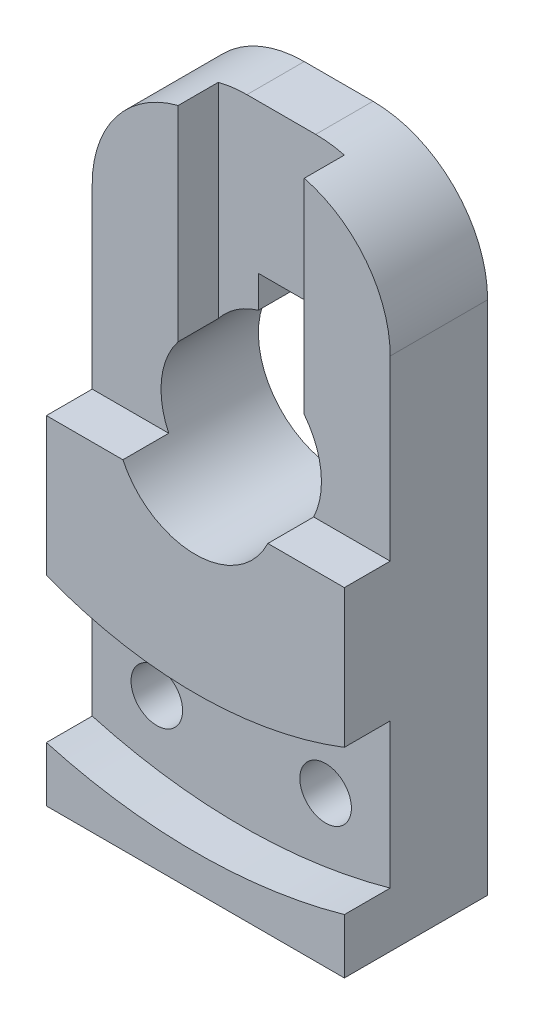
ISO-10303-21;
HEADER;
FILE_DESCRIPTION(('STEP AP214'),'2;1');
FILE_NAME('part.step','',(''),(''),'','','');
FILE_SCHEMA(('AUTOMOTIVE_DESIGN { 1 0 10303 214 1 1 1 1 }'));
ENDSEC;
DATA;
#1=APPLICATION_CONTEXT('core data for automotive mechanical design processes');
#2=APPLICATION_PROTOCOL_DEFINITION('international standard','automotive_design',2000,#1);
#3=PRODUCT_CONTEXT('',#1,'mechanical');
#4=PRODUCT('Part','Part','',(#3));
#5=PRODUCT_RELATED_PRODUCT_CATEGORY('part','',(#4));
#6=PRODUCT_DEFINITION_FORMATION('','',#4);
#7=PRODUCT_DEFINITION_CONTEXT('part definition',#1,'design');
#8=PRODUCT_DEFINITION('design','',#6,#7);
#9=PRODUCT_DEFINITION_SHAPE('','',#8);
#10=(LENGTH_UNIT() NAMED_UNIT(*) SI_UNIT(.MILLI.,.METRE.));
#11=(NAMED_UNIT(*) PLANE_ANGLE_UNIT() SI_UNIT($,.RADIAN.));
#12=(NAMED_UNIT(*) SI_UNIT($,.STERADIAN.) SOLID_ANGLE_UNIT());
#13=UNCERTAINTY_MEASURE_WITH_UNIT(LENGTH_MEASURE(1.E-05),#10,'distance_accuracy_value','');
#14=(GEOMETRIC_REPRESENTATION_CONTEXT(3) GLOBAL_UNCERTAINTY_ASSIGNED_CONTEXT((#13)) GLOBAL_UNIT_ASSIGNED_CONTEXT((#10,
#11,#12)) REPRESENTATION_CONTEXT('',''));
#15=CARTESIAN_POINT('',(0.,0.,0.));
#16=DIRECTION('',(0.,0.,1.));
#17=DIRECTION('',(1.,0.,0.));
#18=AXIS2_PLACEMENT_3D('',#15,#16,#17);
#19=CARTESIAN_POINT('',(-26.,0.,12.5));
#20=DIRECTION('',(-1.,0.,0.));
#21=DIRECTION('',(0.,0.,1.));
#22=AXIS2_PLACEMENT_3D('',#19,#20,#21);
#23=PLANE('',#22);
#24=DIRECTION('',(0.,-1.,0.));
#25=VECTOR('',#24,1.);
#26=CARTESIAN_POINT('',(-26.,9.58787958281663,4.5));
#27=LINE('',#26,#25);
#28=CARTESIAN_POINT('',(-26.,34.8583586736219,4.5));
#29=VERTEX_POINT('',#28);
#30=CARTESIAN_POINT('',(-26.,9.58787958281663,4.5));
#31=VERTEX_POINT('',#30);
#32=EDGE_CURVE('E649',#29,#31,#27,.T.);
#33=ORIENTED_EDGE('',*,*,#32,.F.);
#34=DIRECTION('',(0.,0.,1.));
#35=VECTOR('',#34,1.);
#36=CARTESIAN_POINT('',(-26.,34.8583586736219,4.5));
#37=LINE('',#36,#35);
#38=CARTESIAN_POINT('',(-26.,34.8583586736219,12.5));
#39=VERTEX_POINT('',#38);
#40=EDGE_CURVE('E602',#29,#39,#37,.T.);
#41=ORIENTED_EDGE('',*,*,#40,.T.);
#42=DIRECTION('',(0.,1.,0.));
#43=VECTOR('',#42,1.);
#44=CARTESIAN_POINT('',(-26.,0.,12.5));
#45=LINE('',#44,#43);
#46=CARTESIAN_POINT('',(-26.,59.,12.5));
#47=VERTEX_POINT('',#46);
#48=EDGE_CURVE('E204',#39,#47,#45,.T.);
#49=ORIENTED_EDGE('',*,*,#48,.T.);
#50=DIRECTION('',(0.,0.,1.));
#51=VECTOR('',#50,1.);
#52=CARTESIAN_POINT('',(-26.,59.,12.5));
#53=LINE('',#52,#51);
#54=CARTESIAN_POINT('',(-26.,59.,4.5));
#55=VERTEX_POINT('',#54);
#56=EDGE_CURVE('E282',#55,#47,#53,.T.);
#57=ORIENTED_EDGE('',*,*,#56,.F.);
#58=DIRECTION('',(0.,-1.,0.));
#59=VECTOR('',#58,1.);
#60=CARTESIAN_POINT('',(-26.,110.000012,4.5));
#61=LINE('',#60,#59);
#62=CARTESIAN_POINT('',(-26.,90.,4.5));
#63=VERTEX_POINT('',#62);
#64=EDGE_CURVE('E290',#63,#55,#61,.T.);
#65=ORIENTED_EDGE('',*,*,#64,.F.);
#66=DIRECTION('',(0.,0.,-1.));
#67=VECTOR('',#66,1.);
#68=CARTESIAN_POINT('',(-26.,90.,12.5));
#69=LINE('',#68,#67);
#70=CARTESIAN_POINT('',(-26.,90.,-12.5));
#71=VERTEX_POINT('',#70);
#72=EDGE_CURVE('E214',#63,#71,#69,.T.);
#73=ORIENTED_EDGE('',*,*,#72,.T.);
#74=DIRECTION('',(0.,1.,0.));
#75=VECTOR('',#74,1.);
#76=CARTESIAN_POINT('',(-26.,0.,-12.5));
#77=LINE('',#76,#75);
#78=CARTESIAN_POINT('',(-26.,0.,-12.5));
#79=VERTEX_POINT('',#78);
#80=EDGE_CURVE('E206',#79,#71,#77,.T.);
#81=ORIENTED_EDGE('',*,*,#80,.F.);
#82=DIRECTION('',(0.,0.,-1.));
#83=VECTOR('',#82,1.);
#84=CARTESIAN_POINT('',(-26.,0.,12.5));
#85=LINE('',#84,#83);
#86=CARTESIAN_POINT('',(-26.,0.,12.5));
#87=VERTEX_POINT('',#86);
#88=EDGE_CURVE('E215',#87,#79,#85,.T.);
#89=ORIENTED_EDGE('',*,*,#88,.F.);
#90=CARTESIAN_POINT('',(-26.,9.58787958281663,12.5));
#91=VERTEX_POINT('',#90);
#92=EDGE_CURVE('E347',#87,#91,#45,.T.);
#93=ORIENTED_EDGE('',*,*,#92,.T.);
#94=DIRECTION('',(0.,0.,1.));
#95=VECTOR('',#94,1.);
#96=CARTESIAN_POINT('',(-26.,9.58787958281663,4.5));
#97=LINE('',#96,#95);
#98=EDGE_CURVE('E600',#31,#91,#97,.T.);
#99=ORIENTED_EDGE('',*,*,#98,.F.);
#100=EDGE_LOOP('',(#33,#41,#49,#57,#65,#73,#81,#89,#93,#99));
#101=FACE_BOUND('',#100,.T.);
#102=ADVANCED_FACE('F50',(#101),#23,.T.);
#103=CARTESIAN_POINT('',(-14.7289151952433,18.2858491223179,12.5));
#104=DIRECTION('',(0.,0.,-1.));
#105=DIRECTION('',(-1.,0.,0.));
#106=AXIS2_PLACEMENT_3D('',#103,#104,#105);
#107=CYLINDRICAL_SURFACE('',#106,4.5);
#108=CARTESIAN_POINT('',(-14.7289151952433,18.2858491223179,-12.5));
#109=DIRECTION('',(0.,0.,1.));
#110=DIRECTION('',(1.,0.,0.));
#111=AXIS2_PLACEMENT_3D('',#108,#109,#110);
#112=CIRCLE('',#111,4.5);
#113=CARTESIAN_POINT('',(-10.2289151952433,18.2858491223179,-12.5));
#114=VERTEX_POINT('',#113);
#115=EDGE_CURVE('E363',#114,#114,#112,.T.);
#116=ORIENTED_EDGE('',*,*,#115,.F.);
#117=EDGE_LOOP('',(#116));
#118=FACE_BOUND('',#117,.T.);
#119=CARTESIAN_POINT('',(-14.7289151952433,18.2858491223179,4.5));
#120=DIRECTION('',(0.,0.,1.));
#121=DIRECTION('',(1.,0.,0.));
#122=AXIS2_PLACEMENT_3D('',#119,#120,#121);
#123=CIRCLE('',#122,4.5);
#124=CARTESIAN_POINT('',(-10.2289151952433,18.2858491223179,4.5));
#125=VERTEX_POINT('',#124);
#126=EDGE_CURVE('E591',#125,#125,#123,.T.);
#127=ORIENTED_EDGE('',*,*,#126,.T.);
#128=EDGE_LOOP('',(#127));
#129=FACE_BOUND('',#128,.T.);
#130=ADVANCED_FACE('F412',(#118,#129),#107,.F.);
#131=CARTESIAN_POINT('',(14.7289151952433,18.2858491223179,12.5));
#132=DIRECTION('',(0.,0.,-1.));
#133=DIRECTION('',(-1.,0.,0.));
#134=AXIS2_PLACEMENT_3D('',#131,#132,#133);
#135=CYLINDRICAL_SURFACE('',#134,4.5);
#136=CARTESIAN_POINT('',(14.7289151952433,18.2858491223179,-12.5));
#137=DIRECTION('',(0.,0.,1.));
#138=DIRECTION('',(1.,0.,0.));
#139=AXIS2_PLACEMENT_3D('',#136,#137,#138);
#140=CIRCLE('',#139,4.5);
#141=CARTESIAN_POINT('',(19.2289151952433,18.2858491223179,-12.5));
#142=VERTEX_POINT('',#141);
#143=EDGE_CURVE('E343',#142,#142,#140,.T.);
#144=ORIENTED_EDGE('',*,*,#143,.F.);
#145=EDGE_LOOP('',(#144));
#146=FACE_BOUND('',#145,.T.);
#147=CARTESIAN_POINT('',(14.7289151952433,18.2858491223179,4.5));
#148=DIRECTION('',(0.,0.,1.));
#149=DIRECTION('',(1.,0.,0.));
#150=AXIS2_PLACEMENT_3D('',#147,#148,#149);
#151=CIRCLE('',#150,4.5);
#152=CARTESIAN_POINT('',(19.2289151952433,18.2858491223179,4.5));
#153=VERTEX_POINT('',#152);
#154=EDGE_CURVE('E592',#153,#153,#151,.T.);
#155=ORIENTED_EDGE('',*,*,#154,.T.);
#156=EDGE_LOOP('',(#155));
#157=FACE_BOUND('',#156,.T.);
#158=ADVANCED_FACE('F47',(#146,#157),#135,.F.);
#159=CARTESIAN_POINT('',(26.,0.,12.5));
#160=DIRECTION('',(1.,0.,0.));
#161=DIRECTION('',(0.,0.,-1.));
#162=AXIS2_PLACEMENT_3D('',#159,#160,#161);
#163=PLANE('',#162);
#164=DIRECTION('',(0.,1.,0.));
#165=VECTOR('',#164,1.);
#166=CARTESIAN_POINT('',(26.,9.58787958281663,4.5));
#167=LINE('',#166,#165);
#168=CARTESIAN_POINT('',(26.,9.58787958281663,4.5));
#169=VERTEX_POINT('',#168);
#170=CARTESIAN_POINT('',(26.,34.8583586736219,4.5));
#171=VERTEX_POINT('',#170);
#172=EDGE_CURVE('E636',#169,#171,#167,.T.);
#173=ORIENTED_EDGE('',*,*,#172,.F.);
#174=DIRECTION('',(0.,0.,1.));
#175=VECTOR('',#174,1.);
#176=CARTESIAN_POINT('',(26.,9.58787958281663,4.5));
#177=LINE('',#176,#175);
#178=CARTESIAN_POINT('',(26.,9.58787958281663,12.5));
#179=VERTEX_POINT('',#178);
#180=EDGE_CURVE('E607',#169,#179,#177,.T.);
#181=ORIENTED_EDGE('',*,*,#180,.T.);
#182=DIRECTION('',(0.,-1.,0.));
#183=VECTOR('',#182,1.);
#184=CARTESIAN_POINT('',(26.,0.,12.5));
#185=LINE('',#184,#183);
#186=CARTESIAN_POINT('',(26.,0.,12.5));
#187=VERTEX_POINT('',#186);
#188=EDGE_CURVE('E351',#179,#187,#185,.T.);
#189=ORIENTED_EDGE('',*,*,#188,.T.);
#190=DIRECTION('',(0.,0.,-1.));
#191=VECTOR('',#190,1.);
#192=CARTESIAN_POINT('',(26.,0.,12.5));
#193=LINE('',#192,#191);
#194=CARTESIAN_POINT('',(26.,0.,-12.5));
#195=VERTEX_POINT('',#194);
#196=EDGE_CURVE('E164',#187,#195,#193,.T.);
#197=ORIENTED_EDGE('',*,*,#196,.T.);
#198=DIRECTION('',(0.,-1.,0.));
#199=VECTOR('',#198,1.);
#200=CARTESIAN_POINT('',(26.,0.,-12.5));
#201=LINE('',#200,#199);
#202=CARTESIAN_POINT('',(26.,90.,-12.5));
#203=VERTEX_POINT('',#202);
#204=EDGE_CURVE('E189',#203,#195,#201,.T.);
#205=ORIENTED_EDGE('',*,*,#204,.F.);
#206=DIRECTION('',(0.,0.,-1.));
#207=VECTOR('',#206,1.);
#208=CARTESIAN_POINT('',(26.,90.,12.5));
#209=LINE('',#208,#207);
#210=CARTESIAN_POINT('',(26.,90.,4.5));
#211=VERTEX_POINT('',#210);
#212=EDGE_CURVE('E175',#211,#203,#209,.T.);
#213=ORIENTED_EDGE('',*,*,#212,.F.);
#214=DIRECTION('',(0.,-1.,0.));
#215=VECTOR('',#214,1.);
#216=CARTESIAN_POINT('',(26.,110.000012,4.5));
#217=LINE('',#216,#215);
#218=CARTESIAN_POINT('',(26.,59.,4.5));
#219=VERTEX_POINT('',#218);
#220=EDGE_CURVE('E298',#211,#219,#217,.T.);
#221=ORIENTED_EDGE('',*,*,#220,.T.);
#222=DIRECTION('',(0.,0.,-1.));
#223=VECTOR('',#222,1.);
#224=CARTESIAN_POINT('',(26.,59.,12.5));
#225=LINE('',#224,#223);
#226=CARTESIAN_POINT('',(26.,59.,12.5));
#227=VERTEX_POINT('',#226);
#228=EDGE_CURVE('E273',#227,#219,#225,.T.);
#229=ORIENTED_EDGE('',*,*,#228,.F.);
#230=CARTESIAN_POINT('',(26.,34.8583586736219,12.5));
#231=VERTEX_POINT('',#230);
#232=EDGE_CURVE('E224',#227,#231,#185,.T.);
#233=ORIENTED_EDGE('',*,*,#232,.T.);
#234=DIRECTION('',(0.,0.,1.));
#235=VECTOR('',#234,1.);
#236=CARTESIAN_POINT('',(26.,34.8583586736219,4.5));
#237=LINE('',#236,#235);
#238=EDGE_CURVE('E642',#171,#231,#237,.T.);
#239=ORIENTED_EDGE('',*,*,#238,.F.);
#240=EDGE_LOOP('',(#173,#181,#189,#197,#205,#213,#221,#229,#233,#239));
#241=FACE_BOUND('',#240,.T.);
#242=ADVANCED_FACE('F198',(#241),#163,.T.);
#243=CARTESIAN_POINT('',(0.,0.,12.5));
#244=DIRECTION('',(0.,0.,1.));
#245=DIRECTION('',(1.,0.,0.));
#246=AXIS2_PLACEMENT_3D('',#243,#244,#245);
#247=PLANE('',#246);
#248=CARTESIAN_POINT('',(0.,102.,12.5));
#249=DIRECTION('',(0.,0.,1.));
#250=DIRECTION('',(1.,0.,0.));
#251=AXIS2_PLACEMENT_3D('',#248,#249,#250);
#252=CIRCLE('',#251,96.);
#253=EDGE_CURVE('E633',#91,#179,#252,.T.);
#254=ORIENTED_EDGE('',*,*,#253,.F.);
#255=ORIENTED_EDGE('',*,*,#92,.F.);
#256=DIRECTION('',(-1.,0.,0.));
#257=VECTOR('',#256,1.);
#258=CARTESIAN_POINT('',(0.,0.,12.5));
#259=LINE('',#258,#257);
#260=EDGE_CURVE('E348',#187,#87,#259,.T.);
#261=ORIENTED_EDGE('',*,*,#260,.F.);
#262=ORIENTED_EDGE('',*,*,#188,.F.);
#263=EDGE_LOOP('',(#254,#255,#261,#262));
#264=FACE_BOUND('',#263,.T.);
#265=ADVANCED_FACE('F527',(#264),#247,.T.);
#266=CARTESIAN_POINT('',(0.,102.,12.5));
#267=DIRECTION('',(0.,0.,-1.));
#268=DIRECTION('',(1.,0.,0.));
#269=AXIS2_PLACEMENT_3D('',#266,#267,#268);
#270=CIRCLE('',#269,72.);
#271=EDGE_CURVE('E623',#231,#39,#270,.T.);
#272=ORIENTED_EDGE('',*,*,#271,.F.);
#273=ORIENTED_EDGE('',*,*,#232,.F.);
#274=DIRECTION('',(1.,0.,0.));
#275=VECTOR('',#274,1.);
#276=CARTESIAN_POINT('',(-26.,59.,12.5));
#277=LINE('',#276,#275);
#278=CARTESIAN_POINT('',(12.6491106406735,59.,12.5));
#279=VERTEX_POINT('',#278);
#280=EDGE_CURVE('E237',#279,#227,#277,.T.);
#281=ORIENTED_EDGE('',*,*,#280,.F.);
#282=CARTESIAN_POINT('',(0.,65.,12.5));
#283=DIRECTION('',(0.,0.,1.));
#284=DIRECTION('',(1.,0.,0.));
#285=AXIS2_PLACEMENT_3D('',#282,#283,#284);
#286=CIRCLE('',#285,14.);
#287=CARTESIAN_POINT('',(-12.6491106406735,59.,12.5));
#288=VERTEX_POINT('',#287);
#289=EDGE_CURVE('E196',#288,#279,#286,.T.);
#290=ORIENTED_EDGE('',*,*,#289,.F.);
#291=EDGE_CURVE('E284',#47,#288,#277,.T.);
#292=ORIENTED_EDGE('',*,*,#291,.F.);
#293=ORIENTED_EDGE('',*,*,#48,.F.);
#294=EDGE_LOOP('',(#272,#273,#281,#290,#292,#293));
#295=FACE_BOUND('',#294,.T.);
#296=ADVANCED_FACE('F429',(#295),#247,.T.);
#297=CARTESIAN_POINT('',(6.,90.,12.5));
#298=DIRECTION('',(0.,0.,-1.));
#299=DIRECTION('',(-1.,0.,0.));
#300=AXIS2_PLACEMENT_3D('',#297,#298,#299);
#301=CYLINDRICAL_SURFACE('',#300,20.);
#302=DIRECTION('',(0.,0.,-1.));
#303=VECTOR('',#302,1.);
#304=CARTESIAN_POINT('',(11.,109.364916731037,12.5));
#305=LINE('',#304,#303);
#306=CARTESIAN_POINT('',(11.,109.364916731037,-2.5));
#307=VERTEX_POINT('',#306);
#308=CARTESIAN_POINT('',(11.,109.364916731037,4.5));
#309=VERTEX_POINT('',#308);
#310=EDGE_CURVE('E338',#307,#309,#305,.F.);
#311=ORIENTED_EDGE('',*,*,#310,.T.);
#312=CARTESIAN_POINT('',(6.,90.,4.5));
#313=DIRECTION('',(0.,0.,1.));
#314=DIRECTION('',(1.,0.,0.));
#315=AXIS2_PLACEMENT_3D('',#312,#313,#314);
#316=CIRCLE('',#315,20.);
#317=EDGE_CURVE('E178',#309,#211,#316,.F.);
#318=ORIENTED_EDGE('',*,*,#317,.T.);
#319=ORIENTED_EDGE('',*,*,#212,.T.);
#320=CARTESIAN_POINT('',(6.,90.,-12.5));
#321=DIRECTION('',(0.,0.,1.));
#322=DIRECTION('',(1.,0.,0.));
#323=AXIS2_PLACEMENT_3D('',#320,#321,#322);
#324=CIRCLE('',#323,20.);
#325=CARTESIAN_POINT('',(6.,110.,-12.5));
#326=VERTEX_POINT('',#325);
#327=EDGE_CURVE('E177',#326,#203,#324,.F.);
#328=ORIENTED_EDGE('',*,*,#327,.F.);
#329=DIRECTION('',(0.,0.,-1.));
#330=VECTOR('',#329,1.);
#331=CARTESIAN_POINT('',(6.,110.,12.5));
#332=LINE('',#331,#330);
#333=CARTESIAN_POINT('',(6.,110.,-2.5));
#334=VERTEX_POINT('',#333);
#335=EDGE_CURVE('E234',#334,#326,#332,.T.);
#336=ORIENTED_EDGE('',*,*,#335,.F.);
#337=CARTESIAN_POINT('',(6.,90.,-2.5));
#338=DIRECTION('',(0.,0.,1.));
#339=DIRECTION('',(1.,0.,0.));
#340=AXIS2_PLACEMENT_3D('',#337,#338,#339);
#341=CIRCLE('',#340,20.);
#342=EDGE_CURVE('E329',#334,#307,#341,.F.);
#343=ORIENTED_EDGE('',*,*,#342,.T.);
#344=EDGE_LOOP('',(#311,#318,#319,#328,#336,#343));
#345=FACE_BOUND('',#344,.T.);
#346=ADVANCED_FACE('F173',(#345),#301,.T.);
#347=CARTESIAN_POINT('',(-6.,90.,12.5));
#348=DIRECTION('',(0.,0.,-1.));
#349=DIRECTION('',(-1.,0.,0.));
#350=AXIS2_PLACEMENT_3D('',#347,#348,#349);
#351=CYLINDRICAL_SURFACE('',#350,20.);
#352=DIRECTION('',(0.,0.,-1.));
#353=VECTOR('',#352,1.);
#354=CARTESIAN_POINT('',(-11.,109.364916731037,12.5));
#355=LINE('',#354,#353);
#356=CARTESIAN_POINT('',(-11.,109.364916731037,4.5));
#357=VERTEX_POINT('',#356);
#358=CARTESIAN_POINT('',(-11.,109.364916731037,-2.5));
#359=VERTEX_POINT('',#358);
#360=EDGE_CURVE('E337',#357,#359,#355,.T.);
#361=ORIENTED_EDGE('',*,*,#360,.T.);
#362=CARTESIAN_POINT('',(-6.,90.,-2.5));
#363=DIRECTION('',(0.,0.,1.));
#364=DIRECTION('',(1.,0.,0.));
#365=AXIS2_PLACEMENT_3D('',#362,#363,#364);
#366=CIRCLE('',#365,20.);
#367=CARTESIAN_POINT('',(-6.,110.,-2.5));
#368=VERTEX_POINT('',#367);
#369=EDGE_CURVE('E330',#359,#368,#366,.F.);
#370=ORIENTED_EDGE('',*,*,#369,.T.);
#371=DIRECTION('',(0.,0.,-1.));
#372=VECTOR('',#371,1.);
#373=CARTESIAN_POINT('',(-6.,110.,12.5));
#374=LINE('',#373,#372);
#375=CARTESIAN_POINT('',(-6.,110.,-12.5));
#376=VERTEX_POINT('',#375);
#377=EDGE_CURVE('E217',#368,#376,#374,.T.);
#378=ORIENTED_EDGE('',*,*,#377,.T.);
#379=CARTESIAN_POINT('',(-6.,90.,-12.5));
#380=DIRECTION('',(0.,0.,1.));
#381=DIRECTION('',(1.,0.,0.));
#382=AXIS2_PLACEMENT_3D('',#379,#380,#381);
#383=CIRCLE('',#382,20.);
#384=EDGE_CURVE('E385',#71,#376,#383,.F.);
#385=ORIENTED_EDGE('',*,*,#384,.F.);
#386=ORIENTED_EDGE('',*,*,#72,.F.);
#387=CARTESIAN_POINT('',(-6.,90.,4.5));
#388=DIRECTION('',(0.,0.,1.));
#389=DIRECTION('',(1.,0.,0.));
#390=AXIS2_PLACEMENT_3D('',#387,#388,#389);
#391=CIRCLE('',#390,20.);
#392=EDGE_CURVE('E98',#63,#357,#391,.F.);
#393=ORIENTED_EDGE('',*,*,#392,.T.);
#394=EDGE_LOOP('',(#361,#370,#378,#385,#386,#393));
#395=FACE_BOUND('',#394,.T.);
#396=ADVANCED_FACE('F391',(#395),#351,.T.);
#397=CARTESIAN_POINT('',(0.,65.,12.5));
#398=DIRECTION('',(0.,0.,-1.));
#399=DIRECTION('',(-1.,0.,0.));
#400=AXIS2_PLACEMENT_3D('',#397,#398,#399);
#401=CYLINDRICAL_SURFACE('',#400,14.);
#402=DIRECTION('',(0.,0.,-1.));
#403=VECTOR('',#402,1.);
#404=CARTESIAN_POINT('',(11.,73.6602540378444,12.5));
#405=LINE('',#404,#403);
#406=CARTESIAN_POINT('',(11.,73.6602540378444,4.5));
#407=VERTEX_POINT('',#406);
#408=CARTESIAN_POINT('',(11.,73.6602540378444,-2.5));
#409=VERTEX_POINT('',#408);
#410=EDGE_CURVE('E11',#407,#409,#405,.T.);
#411=ORIENTED_EDGE('',*,*,#410,.T.);
#412=CARTESIAN_POINT('',(0.,65.,-2.5));
#413=DIRECTION('',(0.,0.,1.));
#414=DIRECTION('',(1.,0.,0.));
#415=AXIS2_PLACEMENT_3D('',#412,#413,#414);
#416=CIRCLE('',#415,14.);
#417=CARTESIAN_POINT('',(4.,78.4164078649987,-2.5));
#418=VERTEX_POINT('',#417);
#419=EDGE_CURVE('E326',#409,#418,#416,.T.);
#420=ORIENTED_EDGE('',*,*,#419,.T.);
#421=DIRECTION('',(0.,0.,-1.));
#422=VECTOR('',#421,1.);
#423=CARTESIAN_POINT('',(4.,78.4164078649987,12.5));
#424=LINE('',#423,#422);
#425=CARTESIAN_POINT('',(4.,78.4164078649987,-12.5));
#426=VERTEX_POINT('',#425);
#427=EDGE_CURVE('E218',#418,#426,#424,.T.);
#428=ORIENTED_EDGE('',*,*,#427,.T.);
#429=CARTESIAN_POINT('',(0.,65.,-12.5));
#430=DIRECTION('',(0.,0.,1.));
#431=DIRECTION('',(1.,0.,0.));
#432=AXIS2_PLACEMENT_3D('',#429,#430,#431);
#433=CIRCLE('',#432,14.);
#434=CARTESIAN_POINT('',(-4.,78.4164078649987,-12.5));
#435=VERTEX_POINT('',#434);
#436=EDGE_CURVE('E364',#435,#426,#433,.T.);
#437=ORIENTED_EDGE('',*,*,#436,.F.);
#438=DIRECTION('',(0.,0.,-1.));
#439=VECTOR('',#438,1.);
#440=CARTESIAN_POINT('',(-4.,78.4164078649987,12.5));
#441=LINE('',#440,#439);
#442=CARTESIAN_POINT('',(-4.,78.4164078649987,-2.5));
#443=VERTEX_POINT('',#442);
#444=EDGE_CURVE('E185',#443,#435,#441,.T.);
#445=ORIENTED_EDGE('',*,*,#444,.F.);
#446=CARTESIAN_POINT('',(-11.,73.6602540378444,-2.5));
#447=VERTEX_POINT('',#446);
#448=EDGE_CURVE('E325',#443,#447,#416,.T.);
#449=ORIENTED_EDGE('',*,*,#448,.T.);
#450=DIRECTION('',(0.,0.,-1.));
#451=VECTOR('',#450,1.);
#452=CARTESIAN_POINT('',(-11.,73.6602540378444,12.5));
#453=LINE('',#452,#451);
#454=CARTESIAN_POINT('',(-11.,73.6602540378444,4.5));
#455=VERTEX_POINT('',#454);
#456=EDGE_CURVE('E241',#447,#455,#453,.F.);
#457=ORIENTED_EDGE('',*,*,#456,.T.);
#458=CARTESIAN_POINT('',(0.,65.,4.5));
#459=DIRECTION('',(0.,0.,1.));
#460=DIRECTION('',(1.,0.,0.));
#461=AXIS2_PLACEMENT_3D('',#458,#459,#460);
#462=CIRCLE('',#461,14.);
#463=CARTESIAN_POINT('',(-12.6491106406735,59.,4.5));
#464=VERTEX_POINT('',#463);
#465=EDGE_CURVE('E238',#455,#464,#462,.T.);
#466=ORIENTED_EDGE('',*,*,#465,.T.);
#467=DIRECTION('',(0.,0.,-1.));
#468=VECTOR('',#467,1.);
#469=CARTESIAN_POINT('',(-12.6491106406735,59.,12.5));
#470=LINE('',#469,#468);
#471=EDGE_CURVE('E303',#464,#288,#470,.F.);
#472=ORIENTED_EDGE('',*,*,#471,.T.);
#473=ORIENTED_EDGE('',*,*,#289,.T.);
#474=DIRECTION('',(0.,0.,-1.));
#475=VECTOR('',#474,1.);
#476=CARTESIAN_POINT('',(12.6491106406735,59.,12.5));
#477=LINE('',#476,#475);
#478=CARTESIAN_POINT('',(12.6491106406735,59.,4.5));
#479=VERTEX_POINT('',#478);
#480=EDGE_CURVE('E258',#279,#479,#477,.T.);
#481=ORIENTED_EDGE('',*,*,#480,.T.);
#482=CARTESIAN_POINT('',(0.,65.,4.5));
#483=DIRECTION('',(0.,0.,1.));
#484=DIRECTION('',(1.,0.,0.));
#485=AXIS2_PLACEMENT_3D('',#482,#483,#484);
#486=CIRCLE('',#485,14.);
#487=EDGE_CURVE('E60',#479,#407,#486,.T.);
#488=ORIENTED_EDGE('',*,*,#487,.T.);
#489=EDGE_LOOP('',(#411,#420,#428,#437,#445,#449,#457,#466,#472,#473,#481,#488));
#490=FACE_BOUND('',#489,.T.);
#491=ADVANCED_FACE('F251',(#490),#401,.F.);
#492=CARTESIAN_POINT('',(-4.,0.,12.5));
#493=DIRECTION('',(-1.,0.,0.));
#494=DIRECTION('',(0.,0.,1.));
#495=AXIS2_PLACEMENT_3D('',#492,#493,#494);
#496=PLANE('',#495);
#497=DIRECTION('',(0.,1.,0.));
#498=VECTOR('',#497,1.);
#499=CARTESIAN_POINT('',(-4.,0.,-2.5));
#500=LINE('',#499,#498);
#501=CARTESIAN_POINT('',(-4.,84.,-2.5));
#502=VERTEX_POINT('',#501);
#503=EDGE_CURVE('E317',#443,#502,#500,.T.);
#504=ORIENTED_EDGE('',*,*,#503,.F.);
#505=ORIENTED_EDGE('',*,*,#444,.T.);
#506=DIRECTION('',(0.,1.,0.));
#507=VECTOR('',#506,1.);
#508=CARTESIAN_POINT('',(-4.,0.,-12.5));
#509=LINE('',#508,#507);
#510=CARTESIAN_POINT('',(-4.,84.,-12.5));
#511=VERTEX_POINT('',#510);
#512=EDGE_CURVE('E369',#435,#511,#509,.T.);
#513=ORIENTED_EDGE('',*,*,#512,.T.);
#514=DIRECTION('',(0.,0.,-1.));
#515=VECTOR('',#514,1.);
#516=CARTESIAN_POINT('',(-4.,84.,12.5));
#517=LINE('',#516,#515);
#518=EDGE_CURVE('E227',#502,#511,#517,.T.);
#519=ORIENTED_EDGE('',*,*,#518,.F.);
#520=EDGE_LOOP('',(#504,#505,#513,#519));
#521=FACE_BOUND('',#520,.T.);
#522=ADVANCED_FACE('F440',(#521),#496,.F.);
#523=CARTESIAN_POINT('',(0.,84.,12.5));
#524=DIRECTION('',(0.,1.,0.));
#525=DIRECTION('',(0.,0.,1.));
#526=AXIS2_PLACEMENT_3D('',#523,#524,#525);
#527=PLANE('',#526);
#528=DIRECTION('',(1.,0.,0.));
#529=VECTOR('',#528,1.);
#530=CARTESIAN_POINT('',(0.,84.,-2.5));
#531=LINE('',#530,#529);
#532=CARTESIAN_POINT('',(4.,84.,-2.5));
#533=VERTEX_POINT('',#532);
#534=EDGE_CURVE('E71',#502,#533,#531,.T.);
#535=ORIENTED_EDGE('',*,*,#534,.F.);
#536=ORIENTED_EDGE('',*,*,#518,.T.);
#537=DIRECTION('',(1.,0.,0.));
#538=VECTOR('',#537,1.);
#539=CARTESIAN_POINT('',(0.,84.,-12.5));
#540=LINE('',#539,#538);
#541=CARTESIAN_POINT('',(4.,84.,-12.5));
#542=VERTEX_POINT('',#541);
#543=EDGE_CURVE('E373',#511,#542,#540,.T.);
#544=ORIENTED_EDGE('',*,*,#543,.T.);
#545=DIRECTION('',(0.,0.,-1.));
#546=VECTOR('',#545,1.);
#547=CARTESIAN_POINT('',(4.,84.,12.5));
#548=LINE('',#547,#546);
#549=EDGE_CURVE('E225',#533,#542,#548,.T.);
#550=ORIENTED_EDGE('',*,*,#549,.F.);
#551=EDGE_LOOP('',(#535,#536,#544,#550));
#552=FACE_BOUND('',#551,.T.);
#553=ADVANCED_FACE('F433',(#552),#527,.F.);
#554=CARTESIAN_POINT('',(4.,0.,12.5));
#555=DIRECTION('',(-1.,0.,0.));
#556=DIRECTION('',(0.,0.,1.));
#557=AXIS2_PLACEMENT_3D('',#554,#555,#556);
#558=PLANE('',#557);
#559=ORIENTED_EDGE('',*,*,#427,.F.);
#560=DIRECTION('',(0.,1.,0.));
#561=VECTOR('',#560,1.);
#562=CARTESIAN_POINT('',(4.,0.,-2.5));
#563=LINE('',#562,#561);
#564=EDGE_CURVE('E240',#418,#533,#563,.T.);
#565=ORIENTED_EDGE('',*,*,#564,.T.);
#566=ORIENTED_EDGE('',*,*,#549,.T.);
#567=DIRECTION('',(0.,1.,0.));
#568=VECTOR('',#567,1.);
#569=CARTESIAN_POINT('',(4.,0.,-12.5));
#570=LINE('',#569,#568);
#571=EDGE_CURVE('E194',#426,#542,#570,.T.);
#572=ORIENTED_EDGE('',*,*,#571,.F.);
#573=EDGE_LOOP('',(#559,#565,#566,#572));
#574=FACE_BOUND('',#573,.T.);
#575=ADVANCED_FACE('F430',(#574),#558,.T.);
#576=CARTESIAN_POINT('',(0.,110.,12.5));
#577=DIRECTION('',(0.,1.,0.));
#578=DIRECTION('',(0.,0.,1.));
#579=AXIS2_PLACEMENT_3D('',#576,#577,#578);
#580=PLANE('',#579);
#581=DIRECTION('',(-1.,0.,0.));
#582=VECTOR('',#581,1.);
#583=CARTESIAN_POINT('',(11.,110.,-2.5));
#584=LINE('',#583,#582);
#585=EDGE_CURVE('E51',#334,#368,#584,.T.);
#586=ORIENTED_EDGE('',*,*,#585,.F.);
#587=ORIENTED_EDGE('',*,*,#335,.T.);
#588=DIRECTION('',(1.,0.,0.));
#589=VECTOR('',#588,1.);
#590=CARTESIAN_POINT('',(0.,110.,-12.5));
#591=LINE('',#590,#589);
#592=EDGE_CURVE('E191',#376,#326,#591,.T.);
#593=ORIENTED_EDGE('',*,*,#592,.F.);
#594=ORIENTED_EDGE('',*,*,#377,.F.);
#595=EDGE_LOOP('',(#586,#587,#593,#594));
#596=FACE_BOUND('',#595,.T.);
#597=ADVANCED_FACE('F397',(#596),#580,.T.);
#598=CARTESIAN_POINT('',(0.,0.,12.5));
#599=DIRECTION('',(0.,-1.,0.));
#600=DIRECTION('',(0.,0.,-1.));
#601=AXIS2_PLACEMENT_3D('',#598,#599,#600);
#602=PLANE('',#601);
#603=DIRECTION('',(-1.,0.,0.));
#604=VECTOR('',#603,1.);
#605=CARTESIAN_POINT('',(0.,0.,-12.5));
#606=LINE('',#605,#604);
#607=EDGE_CURVE('E200',#195,#79,#606,.T.);
#608=ORIENTED_EDGE('',*,*,#607,.F.);
#609=ORIENTED_EDGE('',*,*,#196,.F.);
#610=ORIENTED_EDGE('',*,*,#260,.T.);
#611=ORIENTED_EDGE('',*,*,#88,.T.);
#612=EDGE_LOOP('',(#608,#609,#610,#611));
#613=FACE_BOUND('',#612,.T.);
#614=ADVANCED_FACE('F423',(#613),#602,.T.);
#615=CARTESIAN_POINT('',(0.,0.,-12.5));
#616=DIRECTION('',(0.,0.,1.));
#617=DIRECTION('',(1.,0.,0.));
#618=AXIS2_PLACEMENT_3D('',#615,#616,#617);
#619=PLANE('',#618);
#620=ORIENTED_EDGE('',*,*,#143,.T.);
#621=EDGE_LOOP('',(#620));
#622=FACE_BOUND('',#621,.T.);
#623=ORIENTED_EDGE('',*,*,#115,.T.);
#624=EDGE_LOOP('',(#623));
#625=FACE_BOUND('',#624,.T.);
#626=ORIENTED_EDGE('',*,*,#436,.T.);
#627=ORIENTED_EDGE('',*,*,#571,.T.);
#628=ORIENTED_EDGE('',*,*,#543,.F.);
#629=ORIENTED_EDGE('',*,*,#512,.F.);
#630=EDGE_LOOP('',(#626,#627,#628,#629));
#631=FACE_BOUND('',#630,.T.);
#632=ORIENTED_EDGE('',*,*,#327,.T.);
#633=ORIENTED_EDGE('',*,*,#204,.T.);
#634=ORIENTED_EDGE('',*,*,#607,.T.);
#635=ORIENTED_EDGE('',*,*,#80,.T.);
#636=ORIENTED_EDGE('',*,*,#384,.T.);
#637=ORIENTED_EDGE('',*,*,#592,.T.);
#638=EDGE_LOOP('',(#632,#633,#634,#635,#636,#637));
#639=FACE_BOUND('',#638,.T.);
#640=ADVANCED_FACE('F187',(#622,#625,#631,#639),#619,.F.);
#641=CARTESIAN_POINT('',(0.,59.,0.));
#642=DIRECTION('',(0.,1.,0.));
#643=DIRECTION('',(0.,0.,1.));
#644=AXIS2_PLACEMENT_3D('',#641,#642,#643);
#645=PLANE('',#644);
#646=ORIENTED_EDGE('',*,*,#280,.T.);
#647=ORIENTED_EDGE('',*,*,#228,.T.);
#648=DIRECTION('',(-1.,0.,0.));
#649=VECTOR('',#648,1.);
#650=CARTESIAN_POINT('',(26.,59.,4.5));
#651=LINE('',#650,#649);
#652=EDGE_CURVE('E263',#219,#479,#651,.T.);
#653=ORIENTED_EDGE('',*,*,#652,.T.);
#654=ORIENTED_EDGE('',*,*,#480,.F.);
#655=EDGE_LOOP('',(#646,#647,#653,#654));
#656=FACE_BOUND('',#655,.T.);
#657=ADVANCED_FACE('F269',(#656),#645,.T.);
#658=CARTESIAN_POINT('',(26.,110.000012,4.5));
#659=DIRECTION('',(0.,0.,1.));
#660=DIRECTION('',(1.,0.,0.));
#661=AXIS2_PLACEMENT_3D('',#658,#659,#660);
#662=PLANE('',#661);
#663=DIRECTION('',(0.,-1.,0.));
#664=VECTOR('',#663,1.);
#665=CARTESIAN_POINT('',(11.,110.000012,4.5));
#666=LINE('',#665,#664);
#667=EDGE_CURVE('E266',#309,#407,#666,.T.);
#668=ORIENTED_EDGE('',*,*,#667,.T.);
#669=ORIENTED_EDGE('',*,*,#487,.F.);
#670=ORIENTED_EDGE('',*,*,#652,.F.);
#671=ORIENTED_EDGE('',*,*,#220,.F.);
#672=ORIENTED_EDGE('',*,*,#317,.F.);
#673=EDGE_LOOP('',(#668,#669,#670,#671,#672));
#674=FACE_BOUND('',#673,.T.);
#675=ADVANCED_FACE('F261',(#674),#662,.T.);
#676=CARTESIAN_POINT('',(11.,110.000012,4.5));
#677=DIRECTION('',(-1.,0.,0.));
#678=DIRECTION('',(0.,0.,1.));
#679=AXIS2_PLACEMENT_3D('',#676,#677,#678);
#680=PLANE('',#679);
#681=DIRECTION('',(0.,-1.,0.));
#682=VECTOR('',#681,1.);
#683=CARTESIAN_POINT('',(11.,110.000012,-2.5));
#684=LINE('',#683,#682);
#685=EDGE_CURVE('E301',#307,#409,#684,.T.);
#686=ORIENTED_EDGE('',*,*,#685,.T.);
#687=ORIENTED_EDGE('',*,*,#410,.F.);
#688=ORIENTED_EDGE('',*,*,#667,.F.);
#689=ORIENTED_EDGE('',*,*,#310,.F.);
#690=EDGE_LOOP('',(#686,#687,#688,#689));
#691=FACE_BOUND('',#690,.T.);
#692=ADVANCED_FACE('F402',(#691),#680,.T.);
#693=CARTESIAN_POINT('',(11.,110.000012,-2.5));
#694=DIRECTION('',(0.,0.,1.));
#695=DIRECTION('',(1.,0.,0.));
#696=AXIS2_PLACEMENT_3D('',#693,#694,#695);
#697=PLANE('',#696);
#698=ORIENTED_EDGE('',*,*,#585,.T.);
#699=ORIENTED_EDGE('',*,*,#369,.F.);
#700=DIRECTION('',(0.,-1.,0.));
#701=VECTOR('',#700,1.);
#702=CARTESIAN_POINT('',(-11.,110.000012,-2.5));
#703=LINE('',#702,#701);
#704=EDGE_CURVE('E300',#359,#447,#703,.T.);
#705=ORIENTED_EDGE('',*,*,#704,.T.);
#706=ORIENTED_EDGE('',*,*,#448,.F.);
#707=ORIENTED_EDGE('',*,*,#503,.T.);
#708=ORIENTED_EDGE('',*,*,#534,.T.);
#709=ORIENTED_EDGE('',*,*,#564,.F.);
#710=ORIENTED_EDGE('',*,*,#419,.F.);
#711=ORIENTED_EDGE('',*,*,#685,.F.);
#712=ORIENTED_EDGE('',*,*,#342,.F.);
#713=EDGE_LOOP('',(#698,#699,#705,#706,#707,#708,#709,#710,#711,#712));
#714=FACE_BOUND('',#713,.T.);
#715=ADVANCED_FACE('F398',(#714),#697,.T.);
#716=CARTESIAN_POINT('',(-11.,110.000012,4.5));
#717=DIRECTION('',(1.,0.,0.));
#718=DIRECTION('',(0.,0.,-1.));
#719=AXIS2_PLACEMENT_3D('',#716,#717,#718);
#720=PLANE('',#719);
#721=DIRECTION('',(0.,-1.,0.));
#722=VECTOR('',#721,1.);
#723=CARTESIAN_POINT('',(-11.,110.000012,4.5));
#724=LINE('',#723,#722);
#725=EDGE_CURVE('E291',#357,#455,#724,.T.);
#726=ORIENTED_EDGE('',*,*,#725,.T.);
#727=ORIENTED_EDGE('',*,*,#456,.F.);
#728=ORIENTED_EDGE('',*,*,#704,.F.);
#729=ORIENTED_EDGE('',*,*,#360,.F.);
#730=EDGE_LOOP('',(#726,#727,#728,#729));
#731=FACE_BOUND('',#730,.T.);
#732=ADVANCED_FACE('F409',(#731),#720,.T.);
#733=CARTESIAN_POINT('',(-26.,110.000012,4.5));
#734=DIRECTION('',(0.,0.,1.));
#735=DIRECTION('',(1.,0.,0.));
#736=AXIS2_PLACEMENT_3D('',#733,#734,#735);
#737=PLANE('',#736);
#738=ORIENTED_EDGE('',*,*,#64,.T.);
#739=DIRECTION('',(-1.,0.,0.));
#740=VECTOR('',#739,1.);
#741=CARTESIAN_POINT('',(-26.,59.,4.5));
#742=LINE('',#741,#740);
#743=EDGE_CURVE('E277',#464,#55,#742,.T.);
#744=ORIENTED_EDGE('',*,*,#743,.F.);
#745=ORIENTED_EDGE('',*,*,#465,.F.);
#746=ORIENTED_EDGE('',*,*,#725,.F.);
#747=ORIENTED_EDGE('',*,*,#392,.F.);
#748=EDGE_LOOP('',(#738,#744,#745,#746,#747));
#749=FACE_BOUND('',#748,.T.);
#750=ADVANCED_FACE('F502',(#749),#737,.T.);
#751=ORIENTED_EDGE('',*,*,#743,.T.);
#752=ORIENTED_EDGE('',*,*,#56,.T.);
#753=ORIENTED_EDGE('',*,*,#291,.T.);
#754=ORIENTED_EDGE('',*,*,#471,.F.);
#755=EDGE_LOOP('',(#751,#752,#753,#754));
#756=FACE_BOUND('',#755,.T.);
#757=ADVANCED_FACE('F475',(#756),#645,.T.);
#758=CARTESIAN_POINT('',(0.,102.,4.5));
#759=DIRECTION('',(0.,0.,1.));
#760=DIRECTION('',(1.,0.,0.));
#761=AXIS2_PLACEMENT_3D('',#758,#759,#760);
#762=CYLINDRICAL_SURFACE('',#761,96.);
#763=ORIENTED_EDGE('',*,*,#253,.T.);
#764=ORIENTED_EDGE('',*,*,#180,.F.);
#765=CARTESIAN_POINT('',(0.,102.,4.5));
#766=DIRECTION('',(0.,0.,1.));
#767=DIRECTION('',(1.,0.,0.));
#768=AXIS2_PLACEMENT_3D('',#765,#766,#767);
#769=CIRCLE('',#768,96.);
#770=EDGE_CURVE('E61',#31,#169,#769,.T.);
#771=ORIENTED_EDGE('',*,*,#770,.F.);
#772=ORIENTED_EDGE('',*,*,#98,.T.);
#773=EDGE_LOOP('',(#763,#764,#771,#772));
#774=FACE_BOUND('',#773,.T.);
#775=ADVANCED_FACE('F519',(#774),#762,.F.);
#776=CARTESIAN_POINT('',(0.,102.,4.5));
#777=DIRECTION('',(0.,0.,1.));
#778=DIRECTION('',(1.,0.,0.));
#779=AXIS2_PLACEMENT_3D('',#776,#777,#778);
#780=CYLINDRICAL_SURFACE('',#779,72.);
#781=ORIENTED_EDGE('',*,*,#271,.T.);
#782=ORIENTED_EDGE('',*,*,#40,.F.);
#783=CARTESIAN_POINT('',(0.,102.,4.5));
#784=DIRECTION('',(0.,0.,-1.));
#785=DIRECTION('',(1.,0.,0.));
#786=AXIS2_PLACEMENT_3D('',#783,#784,#785);
#787=CIRCLE('',#786,72.);
#788=EDGE_CURVE('E653',#171,#29,#787,.T.);
#789=ORIENTED_EDGE('',*,*,#788,.F.);
#790=ORIENTED_EDGE('',*,*,#238,.T.);
#791=EDGE_LOOP('',(#781,#782,#789,#790));
#792=FACE_BOUND('',#791,.T.);
#793=ADVANCED_FACE('F565',(#792),#780,.T.);
#794=CARTESIAN_POINT('',(0.,102.,4.5));
#795=DIRECTION('',(0.,0.,1.));
#796=DIRECTION('',(1.,0.,0.));
#797=AXIS2_PLACEMENT_3D('',#794,#795,#796);
#798=PLANE('',#797);
#799=ORIENTED_EDGE('',*,*,#126,.F.);
#800=EDGE_LOOP('',(#799));
#801=FACE_BOUND('',#800,.T.);
#802=ORIENTED_EDGE('',*,*,#154,.F.);
#803=EDGE_LOOP('',(#802));
#804=FACE_BOUND('',#803,.T.);
#805=ORIENTED_EDGE('',*,*,#770,.T.);
#806=ORIENTED_EDGE('',*,*,#172,.T.);
#807=ORIENTED_EDGE('',*,*,#788,.T.);
#808=ORIENTED_EDGE('',*,*,#32,.T.);
#809=EDGE_LOOP('',(#805,#806,#807,#808));
#810=FACE_BOUND('',#809,.T.);
#811=ADVANCED_FACE('F573',(#801,#804,#810),#798,.T.);
#812=CLOSED_SHELL('',(#102,#130,#158,#242,#265,#296,#346,#396,#491,#522,#553,#575,#597,#614,
#640,#657,#675,#692,#715,#732,#750,#757,#775,#793,#811));
#813=MANIFOLD_SOLID_BREP('B2',#812);
#814=ADVANCED_BREP_SHAPE_REPRESENTATION('',(#18,#813),#14);
#815=SHAPE_DEFINITION_REPRESENTATION(#9,#814);
ENDSEC;
END-ISO-10303-21;
